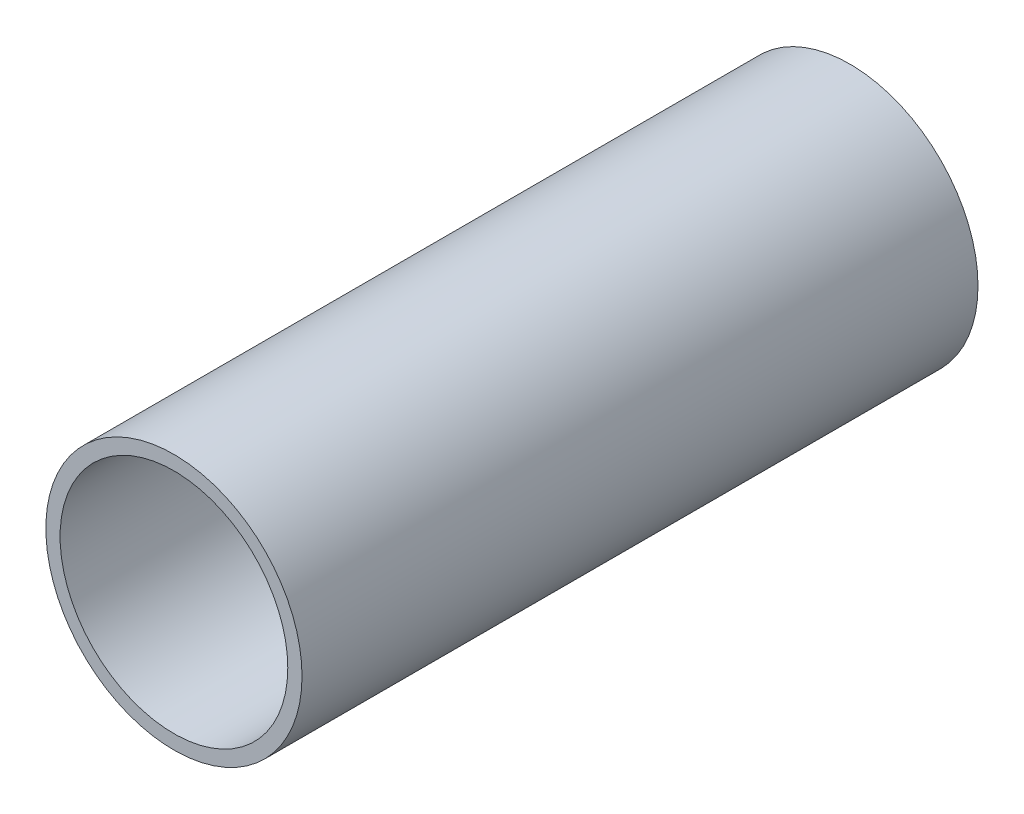
ISO-10303-21;
HEADER;
FILE_DESCRIPTION(('STEP AP214'),'2;1');
FILE_NAME('part.step','',(''),(''),'','','');
FILE_SCHEMA(('AUTOMOTIVE_DESIGN { 1 0 10303 214 1 1 1 1 }'));
ENDSEC;
DATA;
#1=APPLICATION_CONTEXT('core data for automotive mechanical design processes');
#2=APPLICATION_PROTOCOL_DEFINITION('international standard','automotive_design',2000,#1);
#3=PRODUCT_CONTEXT('',#1,'mechanical');
#4=PRODUCT('Part','Part','',(#3));
#5=PRODUCT_RELATED_PRODUCT_CATEGORY('part','',(#4));
#6=PRODUCT_DEFINITION_FORMATION('','',#4);
#7=PRODUCT_DEFINITION_CONTEXT('part definition',#1,'design');
#8=PRODUCT_DEFINITION('design','',#6,#7);
#9=PRODUCT_DEFINITION_SHAPE('','',#8);
#10=(LENGTH_UNIT() NAMED_UNIT(*) SI_UNIT(.MILLI.,.METRE.));
#11=(NAMED_UNIT(*) PLANE_ANGLE_UNIT() SI_UNIT($,.RADIAN.));
#12=(NAMED_UNIT(*) SI_UNIT($,.STERADIAN.) SOLID_ANGLE_UNIT());
#13=UNCERTAINTY_MEASURE_WITH_UNIT(LENGTH_MEASURE(1.E-05),#10,'distance_accuracy_value','');
#14=(GEOMETRIC_REPRESENTATION_CONTEXT(3) GLOBAL_UNCERTAINTY_ASSIGNED_CONTEXT((#13)) GLOBAL_UNIT_ASSIGNED_CONTEXT((#10,
#11,#12)) REPRESENTATION_CONTEXT('',''));
#15=CARTESIAN_POINT('',(0.,0.,0.));
#16=DIRECTION('',(0.,0.,1.));
#17=DIRECTION('',(1.,0.,0.));
#18=AXIS2_PLACEMENT_3D('',#15,#16,#17);
#19=CARTESIAN_POINT('',(0.,0.,150.8125));
#20=DIRECTION('',(0.,0.,1.));
#21=DIRECTION('',(1.,0.,0.));
#22=AXIS2_PLACEMENT_3D('',#19,#20,#21);
#23=PLANE('',#22);
#24=CARTESIAN_POINT('',(0.,0.,150.8125));
#25=DIRECTION('',(0.,0.,1.));
#26=DIRECTION('',(1.,0.,0.));
#27=AXIS2_PLACEMENT_3D('',#24,#25,#26);
#28=CIRCLE('',#27,57.15);
#29=CARTESIAN_POINT('',(57.15,0.,150.8125));
#30=VERTEX_POINT('',#29);
#31=EDGE_CURVE('E10',#30,#30,#28,.T.);
#32=ORIENTED_EDGE('',*,*,#31,.T.);
#33=EDGE_LOOP('',(#32));
#34=FACE_BOUND('',#33,.T.);
#35=CARTESIAN_POINT('',(0.,0.,150.8125));
#36=DIRECTION('',(0.,0.,1.));
#37=DIRECTION('',(1.,0.,0.));
#38=AXIS2_PLACEMENT_3D('',#35,#36,#37);
#39=CIRCLE('',#38,50.8);
#40=CARTESIAN_POINT('',(50.8,0.,150.8125));
#41=VERTEX_POINT('',#40);
#42=EDGE_CURVE('E56',#41,#41,#39,.T.);
#43=ORIENTED_EDGE('',*,*,#42,.F.);
#44=EDGE_LOOP('',(#43));
#45=FACE_BOUND('',#44,.T.);
#46=ADVANCED_FACE('F43',(#34,#45),#23,.T.);
#47=CARTESIAN_POINT('',(0.,0.,-150.8125));
#48=DIRECTION('',(0.,0.,1.));
#49=DIRECTION('',(1.,0.,0.));
#50=AXIS2_PLACEMENT_3D('',#47,#48,#49);
#51=PLANE('',#50);
#52=CARTESIAN_POINT('',(0.,0.,-150.8125));
#53=DIRECTION('',(0.,0.,1.));
#54=DIRECTION('',(1.,0.,0.));
#55=AXIS2_PLACEMENT_3D('',#52,#53,#54);
#56=CIRCLE('',#55,57.15);
#57=CARTESIAN_POINT('',(57.15,0.,-150.8125));
#58=VERTEX_POINT('',#57);
#59=EDGE_CURVE('E47',#58,#58,#56,.T.);
#60=ORIENTED_EDGE('',*,*,#59,.F.);
#61=EDGE_LOOP('',(#60));
#62=FACE_BOUND('',#61,.T.);
#63=CARTESIAN_POINT('',(0.,0.,-150.8125));
#64=DIRECTION('',(0.,0.,1.));
#65=DIRECTION('',(1.,0.,0.));
#66=AXIS2_PLACEMENT_3D('',#63,#64,#65);
#67=CIRCLE('',#66,50.8);
#68=CARTESIAN_POINT('',(50.8,0.,-150.8125));
#69=VERTEX_POINT('',#68);
#70=EDGE_CURVE('E58',#69,#69,#67,.T.);
#71=ORIENTED_EDGE('',*,*,#70,.T.);
#72=EDGE_LOOP('',(#71));
#73=FACE_BOUND('',#72,.T.);
#74=ADVANCED_FACE('F70',(#62,#73),#51,.F.);
#75=CARTESIAN_POINT('',(0.,0.,150.8125));
#76=DIRECTION('',(0.,0.,-1.));
#77=DIRECTION('',(-1.,0.,0.));
#78=AXIS2_PLACEMENT_3D('',#75,#76,#77);
#79=CYLINDRICAL_SURFACE('',#78,57.15);
#80=ORIENTED_EDGE('',*,*,#31,.F.);
#81=EDGE_LOOP('',(#80));
#82=FACE_BOUND('',#81,.T.);
#83=ORIENTED_EDGE('',*,*,#59,.T.);
#84=EDGE_LOOP('',(#83));
#85=FACE_BOUND('',#84,.T.);
#86=ADVANCED_FACE('F45',(#82,#85),#79,.T.);
#87=CARTESIAN_POINT('',(0.,0.,150.8125));
#88=DIRECTION('',(0.,0.,-1.));
#89=DIRECTION('',(-1.,0.,0.));
#90=AXIS2_PLACEMENT_3D('',#87,#88,#89);
#91=CYLINDRICAL_SURFACE('',#90,50.8);
#92=ORIENTED_EDGE('',*,*,#42,.T.);
#93=EDGE_LOOP('',(#92));
#94=FACE_BOUND('',#93,.T.);
#95=ORIENTED_EDGE('',*,*,#70,.F.);
#96=EDGE_LOOP('',(#95));
#97=FACE_BOUND('',#96,.T.);
#98=ADVANCED_FACE('F66',(#94,#97),#91,.F.);
#99=CLOSED_SHELL('',(#46,#74,#86,#98));
#100=MANIFOLD_SOLID_BREP('B2',#99);
#101=ADVANCED_BREP_SHAPE_REPRESENTATION('',(#18,#100),#14);
#102=SHAPE_DEFINITION_REPRESENTATION(#9,#101);
ENDSEC;
END-ISO-10303-21;
